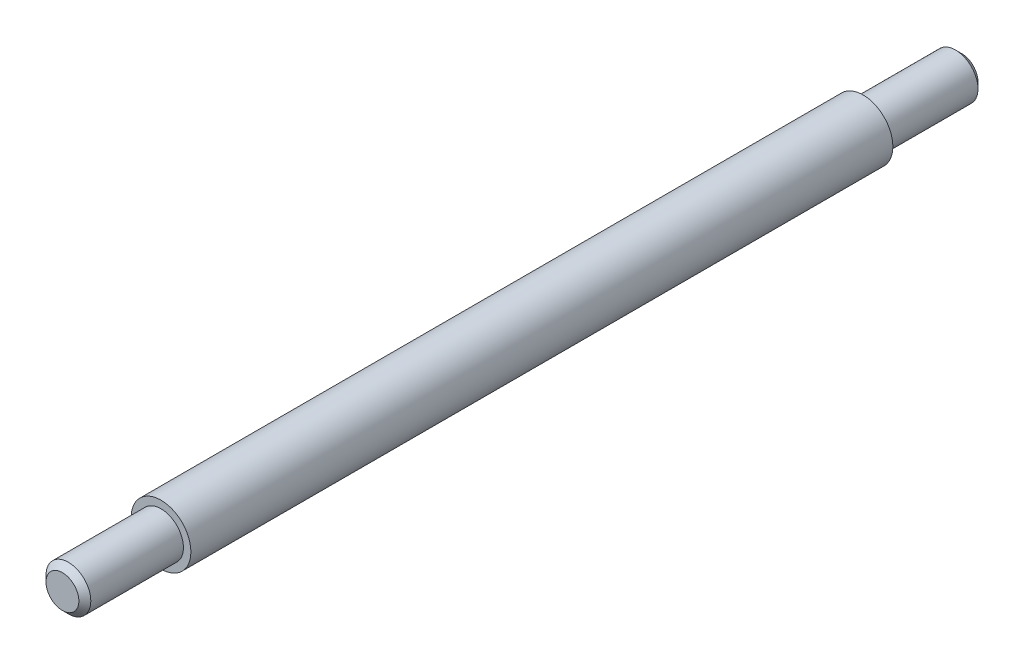
ISO-10303-21;
HEADER;
FILE_DESCRIPTION(('STEP AP214'),'2;1');
FILE_NAME('part.step','',(''),(''),'','','');
FILE_SCHEMA(('AUTOMOTIVE_DESIGN { 1 0 10303 214 1 1 1 1 }'));
ENDSEC;
DATA;
#1=APPLICATION_CONTEXT('core data for automotive mechanical design processes');
#2=APPLICATION_PROTOCOL_DEFINITION('international standard','automotive_design',2000,#1);
#3=PRODUCT_CONTEXT('',#1,'mechanical');
#4=PRODUCT('Part','Part','',(#3));
#5=PRODUCT_RELATED_PRODUCT_CATEGORY('part','',(#4));
#6=PRODUCT_DEFINITION_FORMATION('','',#4);
#7=PRODUCT_DEFINITION_CONTEXT('part definition',#1,'design');
#8=PRODUCT_DEFINITION('design','',#6,#7);
#9=PRODUCT_DEFINITION_SHAPE('','',#8);
#10=(LENGTH_UNIT() NAMED_UNIT(*) SI_UNIT(.MILLI.,.METRE.));
#11=(NAMED_UNIT(*) PLANE_ANGLE_UNIT() SI_UNIT($,.RADIAN.));
#12=(NAMED_UNIT(*) SI_UNIT($,.STERADIAN.) SOLID_ANGLE_UNIT());
#13=UNCERTAINTY_MEASURE_WITH_UNIT(LENGTH_MEASURE(1.E-05),#10,'distance_accuracy_value','');
#14=(GEOMETRIC_REPRESENTATION_CONTEXT(3) GLOBAL_UNCERTAINTY_ASSIGNED_CONTEXT((#13)) GLOBAL_UNIT_ASSIGNED_CONTEXT((#10,
#11,#12)) REPRESENTATION_CONTEXT('',''));
#15=CARTESIAN_POINT('',(0.,0.,0.));
#16=DIRECTION('',(0.,0.,1.));
#17=DIRECTION('',(1.,0.,0.));
#18=AXIS2_PLACEMENT_3D('',#15,#16,#17);
#19=CARTESIAN_POINT('',(0.,0.,-47.));
#20=DIRECTION('',(0.,0.,1.));
#21=DIRECTION('',(1.,0.,0.));
#22=AXIS2_PLACEMENT_3D('',#19,#20,#21);
#23=CYLINDRICAL_SURFACE('',#22,2.);
#24=CARTESIAN_POINT('',(0.,0.,-47.));
#25=DIRECTION('',(0.,0.,1.));
#26=DIRECTION('',(1.,0.,0.));
#27=AXIS2_PLACEMENT_3D('',#24,#25,#26);
#28=CIRCLE('',#27,2.);
#29=CARTESIAN_POINT('',(2.,0.,-47.));
#30=VERTEX_POINT('',#29);
#31=EDGE_CURVE('E55',#30,#30,#28,.T.);
#32=ORIENTED_EDGE('',*,*,#31,.T.);
#33=EDGE_LOOP('',(#32));
#34=FACE_BOUND('',#33,.T.);
#35=CARTESIAN_POINT('',(0.,0.,0.));
#36=DIRECTION('',(0.,0.,1.));
#37=DIRECTION('',(1.,0.,0.));
#38=AXIS2_PLACEMENT_3D('',#35,#36,#37);
#39=CIRCLE('',#38,2.);
#40=CARTESIAN_POINT('',(2.,0.,0.));
#41=VERTEX_POINT('',#40);
#42=EDGE_CURVE('E52',#41,#41,#39,.T.);
#43=ORIENTED_EDGE('',*,*,#42,.F.);
#44=EDGE_LOOP('',(#43));
#45=FACE_BOUND('',#44,.T.);
#46=ADVANCED_FACE('F31',(#34,#45),#23,.T.);
#47=CARTESIAN_POINT('',(0.,0.,-47.));
#48=DIRECTION('',(0.,0.,1.));
#49=DIRECTION('',(1.,0.,0.));
#50=AXIS2_PLACEMENT_3D('',#47,#48,#49);
#51=PLANE('',#50);
#52=CARTESIAN_POINT('',(0.,0.,-47.));
#53=DIRECTION('',(0.,0.,-1.));
#54=DIRECTION('',(-1.,0.,0.));
#55=AXIS2_PLACEMENT_3D('',#52,#53,#54);
#56=CIRCLE('',#55,1.5);
#57=CARTESIAN_POINT('',(-1.5,0.,-47.));
#58=VERTEX_POINT('',#57);
#59=EDGE_CURVE('E51',#58,#58,#56,.T.);
#60=ORIENTED_EDGE('',*,*,#59,.F.);
#61=EDGE_LOOP('',(#60));
#62=FACE_BOUND('',#61,.T.);
#63=ORIENTED_EDGE('',*,*,#31,.F.);
#64=EDGE_LOOP('',(#63));
#65=FACE_BOUND('',#64,.T.);
#66=ADVANCED_FACE('F66',(#62,#65),#51,.F.);
#67=CARTESIAN_POINT('',(0.,0.,0.));
#68=DIRECTION('',(0.,0.,1.));
#69=DIRECTION('',(1.,0.,0.));
#70=AXIS2_PLACEMENT_3D('',#67,#68,#69);
#71=PLANE('',#70);
#72=CARTESIAN_POINT('',(0.,0.,0.));
#73=DIRECTION('',(0.,0.,1.));
#74=DIRECTION('',(1.,0.,0.));
#75=AXIS2_PLACEMENT_3D('',#72,#73,#74);
#76=CIRCLE('',#75,1.5);
#77=CARTESIAN_POINT('',(1.5,0.,0.));
#78=VERTEX_POINT('',#77);
#79=EDGE_CURVE('E58',#78,#78,#76,.T.);
#80=ORIENTED_EDGE('',*,*,#79,.F.);
#81=EDGE_LOOP('',(#80));
#82=FACE_BOUND('',#81,.T.);
#83=ORIENTED_EDGE('',*,*,#42,.T.);
#84=EDGE_LOOP('',(#83));
#85=FACE_BOUND('',#84,.T.);
#86=ADVANCED_FACE('F69',(#82,#85),#71,.T.);
#87=CARTESIAN_POINT('',(0.,0.,6.6));
#88=DIRECTION('',(0.,0.,-1.));
#89=DIRECTION('',(-1.,0.,0.));
#90=AXIS2_PLACEMENT_3D('',#87,#88,#89);
#91=CYLINDRICAL_SURFACE('',#90,1.5);
#92=CARTESIAN_POINT('',(0.,0.,6.20000000000001));
#93=DIRECTION('',(0.,0.,1.));
#94=DIRECTION('',(1.,0.,0.));
#95=AXIS2_PLACEMENT_3D('',#92,#93,#94);
#96=CIRCLE('',#95,1.5);
#97=CARTESIAN_POINT('',(1.5,0.,6.20000000000001));
#98=VERTEX_POINT('',#97);
#99=EDGE_CURVE('E42',#98,#98,#96,.F.);
#100=ORIENTED_EDGE('',*,*,#99,.T.);
#101=EDGE_LOOP('',(#100));
#102=FACE_BOUND('',#101,.T.);
#103=ORIENTED_EDGE('',*,*,#79,.T.);
#104=EDGE_LOOP('',(#103));
#105=FACE_BOUND('',#104,.T.);
#106=ADVANCED_FACE('F79',(#102,#105),#91,.T.);
#107=CARTESIAN_POINT('',(0.,0.,6.6));
#108=DIRECTION('',(0.,0.,1.));
#109=DIRECTION('',(1.,0.,0.));
#110=AXIS2_PLACEMENT_3D('',#107,#108,#109);
#111=PLANE('',#110);
#112=CARTESIAN_POINT('',(0.,0.,6.6));
#113=DIRECTION('',(0.,0.,1.));
#114=DIRECTION('',(1.,0.,0.));
#115=AXIS2_PLACEMENT_3D('',#112,#113,#114);
#116=CIRCLE('',#115,1.10000000000001);
#117=CARTESIAN_POINT('',(1.10000000000001,0.,6.6));
#118=VERTEX_POINT('',#117);
#119=EDGE_CURVE('E46',#118,#118,#116,.T.);
#120=ORIENTED_EDGE('',*,*,#119,.T.);
#121=EDGE_LOOP('',(#120));
#122=FACE_BOUND('',#121,.T.);
#123=ADVANCED_FACE('F85',(#122),#111,.T.);
#124=CARTESIAN_POINT('',(0.,0.,-53.6));
#125=DIRECTION('',(0.,0.,1.));
#126=DIRECTION('',(1.,0.,0.));
#127=AXIS2_PLACEMENT_3D('',#124,#125,#126);
#128=CYLINDRICAL_SURFACE('',#127,1.5);
#129=CARTESIAN_POINT('',(0.,0.,-53.2));
#130=DIRECTION('',(0.,0.,-1.));
#131=DIRECTION('',(-1.,0.,0.));
#132=AXIS2_PLACEMENT_3D('',#129,#130,#131);
#133=CIRCLE('',#132,1.5);
#134=CARTESIAN_POINT('',(-1.5,0.,-53.2));
#135=VERTEX_POINT('',#134);
#136=EDGE_CURVE('E10',#135,#135,#133,.F.);
#137=ORIENTED_EDGE('',*,*,#136,.T.);
#138=EDGE_LOOP('',(#137));
#139=FACE_BOUND('',#138,.T.);
#140=ORIENTED_EDGE('',*,*,#59,.T.);
#141=EDGE_LOOP('',(#140));
#142=FACE_BOUND('',#141,.T.);
#143=ADVANCED_FACE('F64',(#139,#142),#128,.T.);
#144=CARTESIAN_POINT('',(0.,0.,-53.6));
#145=DIRECTION('',(0.,0.,-1.));
#146=DIRECTION('',(-1.,0.,0.));
#147=AXIS2_PLACEMENT_3D('',#144,#145,#146);
#148=PLANE('',#147);
#149=CARTESIAN_POINT('',(0.,0.,-53.6));
#150=DIRECTION('',(0.,0.,-1.));
#151=DIRECTION('',(-1.,0.,0.));
#152=AXIS2_PLACEMENT_3D('',#149,#150,#151);
#153=CIRCLE('',#152,1.10000000000001);
#154=CARTESIAN_POINT('',(-1.10000000000001,0.,-53.6));
#155=VERTEX_POINT('',#154);
#156=EDGE_CURVE('E38',#155,#155,#153,.T.);
#157=ORIENTED_EDGE('',*,*,#156,.T.);
#158=EDGE_LOOP('',(#157));
#159=FACE_BOUND('',#158,.T.);
#160=ADVANCED_FACE('F91',(#159),#148,.T.);
#161=CARTESIAN_POINT('',(0.,0.,6.6));
#162=DIRECTION('',(0.,0.,-1.));
#163=DIRECTION('',(-1.,0.,0.));
#164=AXIS2_PLACEMENT_3D('',#161,#162,#163);
#165=CONICAL_SURFACE('',#164,1.10000000000001,0.785398163397443);
#166=ORIENTED_EDGE('',*,*,#99,.F.);
#167=EDGE_LOOP('',(#166));
#168=FACE_BOUND('',#167,.T.);
#169=ORIENTED_EDGE('',*,*,#119,.F.);
#170=EDGE_LOOP('',(#169));
#171=FACE_BOUND('',#170,.T.);
#172=ADVANCED_FACE('F89',(#168,#171),#165,.T.);
#173=CARTESIAN_POINT('',(0.,0.,-53.6));
#174=DIRECTION('',(0.,0.,1.));
#175=DIRECTION('',(1.,0.,0.));
#176=AXIS2_PLACEMENT_3D('',#173,#174,#175);
#177=CONICAL_SURFACE('',#176,1.10000000000001,0.785398163397438);
#178=ORIENTED_EDGE('',*,*,#136,.F.);
#179=EDGE_LOOP('',(#178));
#180=FACE_BOUND('',#179,.T.);
#181=ORIENTED_EDGE('',*,*,#156,.F.);
#182=EDGE_LOOP('',(#181));
#183=FACE_BOUND('',#182,.T.);
#184=ADVANCED_FACE('F33',(#180,#183),#177,.T.);
#185=CLOSED_SHELL('',(#46,#66,#86,#106,#123,#143,#160,#172,#184));
#186=MANIFOLD_SOLID_BREP('B2',#185);
#187=ADVANCED_BREP_SHAPE_REPRESENTATION('',(#18,#186),#14);
#188=SHAPE_DEFINITION_REPRESENTATION(#9,#187);
ENDSEC;
END-ISO-10303-21;
